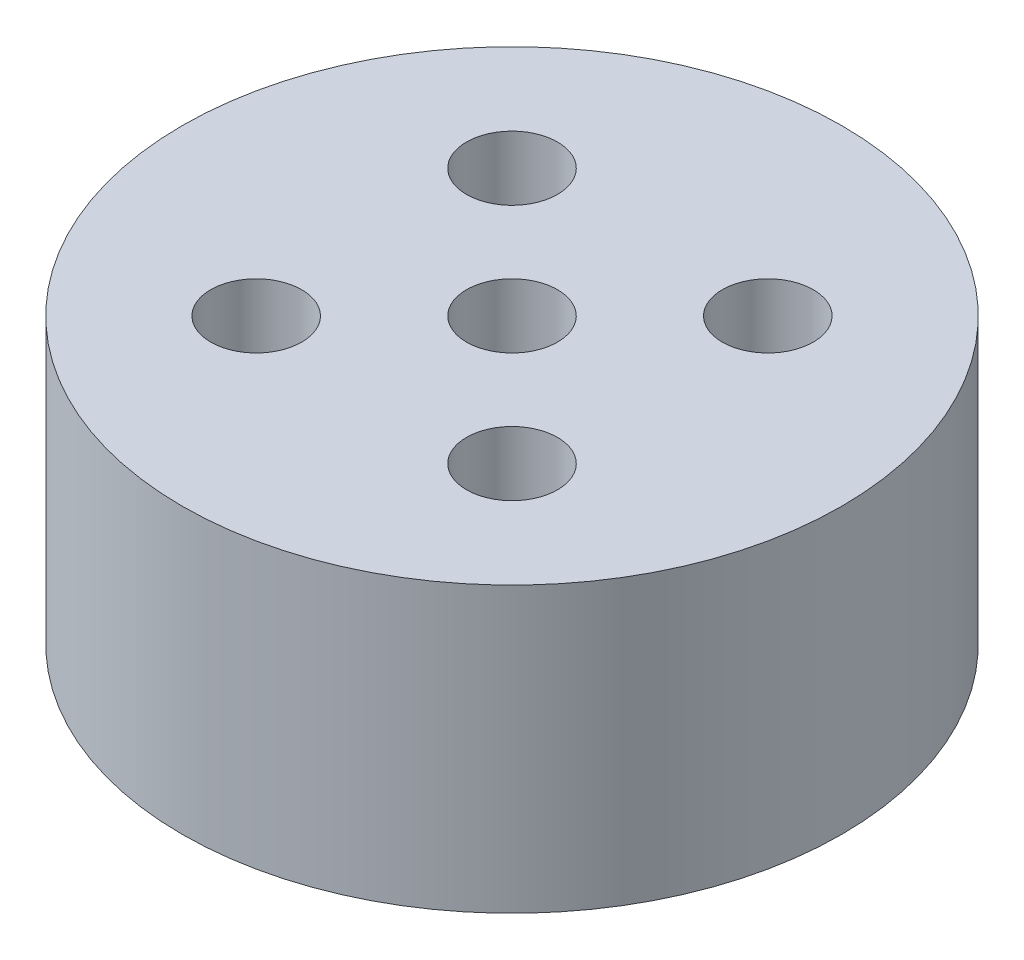
ISO-10303-21;
HEADER;
FILE_DESCRIPTION(('STEP AP214'),'2;1');
FILE_NAME('part.step','',(''),(''),'','','');
FILE_SCHEMA(('AUTOMOTIVE_DESIGN { 1 0 10303 214 1 1 1 1 }'));
ENDSEC;
DATA;
#1=APPLICATION_CONTEXT('core data for automotive mechanical design processes');
#2=APPLICATION_PROTOCOL_DEFINITION('international standard','automotive_design',2000,#1);
#3=PRODUCT_CONTEXT('',#1,'mechanical');
#4=PRODUCT('Part','Part','',(#3));
#5=PRODUCT_RELATED_PRODUCT_CATEGORY('part','',(#4));
#6=PRODUCT_DEFINITION_FORMATION('','',#4);
#7=PRODUCT_DEFINITION_CONTEXT('part definition',#1,'design');
#8=PRODUCT_DEFINITION('design','',#6,#7);
#9=PRODUCT_DEFINITION_SHAPE('','',#8);
#10=(LENGTH_UNIT() NAMED_UNIT(*) SI_UNIT(.MILLI.,.METRE.));
#11=(NAMED_UNIT(*) PLANE_ANGLE_UNIT() SI_UNIT($,.RADIAN.));
#12=(NAMED_UNIT(*) SI_UNIT($,.STERADIAN.) SOLID_ANGLE_UNIT());
#13=UNCERTAINTY_MEASURE_WITH_UNIT(LENGTH_MEASURE(1.E-05),#10,'distance_accuracy_value','');
#14=(GEOMETRIC_REPRESENTATION_CONTEXT(3) GLOBAL_UNCERTAINTY_ASSIGNED_CONTEXT((#13)) GLOBAL_UNIT_ASSIGNED_CONTEXT((#10,
#11,#12)) REPRESENTATION_CONTEXT('',''));
#15=CARTESIAN_POINT('',(0.,0.,0.));
#16=DIRECTION('',(0.,0.,1.));
#17=DIRECTION('',(1.,0.,0.));
#18=AXIS2_PLACEMENT_3D('',#15,#16,#17);
#19=CARTESIAN_POINT('',(-14.7209328967892,12.7,-5.38710001266121));
#20=DIRECTION('',(0.,-1.,0.));
#21=DIRECTION('',(0.,0.,-1.));
#22=AXIS2_PLACEMENT_3D('',#19,#20,#21);
#23=CYLINDRICAL_SURFACE('',#22,14.732);
#24=CARTESIAN_POINT('',(-14.7209328967892,12.7,-5.38710001266121));
#25=DIRECTION('',(0.,1.,0.));
#26=DIRECTION('',(0.,0.,1.));
#27=AXIS2_PLACEMENT_3D('',#24,#25,#26);
#28=CIRCLE('',#27,14.732);
#29=CARTESIAN_POINT('',(-14.7209328967892,12.7,9.34489998733879));
#30=VERTEX_POINT('',#29);
#31=EDGE_CURVE('E10',#30,#30,#28,.T.);
#32=ORIENTED_EDGE('',*,*,#31,.F.);
#33=EDGE_LOOP('',(#32));
#34=FACE_BOUND('',#33,.T.);
#35=CARTESIAN_POINT('',(-14.7209328967892,0.,-5.38710001266121));
#36=DIRECTION('',(0.,1.,0.));
#37=DIRECTION('',(0.,0.,1.));
#38=AXIS2_PLACEMENT_3D('',#35,#36,#37);
#39=CIRCLE('',#38,14.732);
#40=CARTESIAN_POINT('',(-14.7209328967892,0.,9.34489998733879));
#41=VERTEX_POINT('',#40);
#42=EDGE_CURVE('E36',#41,#41,#39,.T.);
#43=ORIENTED_EDGE('',*,*,#42,.T.);
#44=EDGE_LOOP('',(#43));
#45=FACE_BOUND('',#44,.T.);
#46=ADVANCED_FACE('F33',(#34,#45),#23,.T.);
#47=CARTESIAN_POINT('',(-14.7209328967892,12.7,-5.38710001266121));
#48=DIRECTION('',(0.,1.,0.));
#49=DIRECTION('',(0.,0.,1.));
#50=AXIS2_PLACEMENT_3D('',#47,#48,#49);
#51=PLANE('',#50);
#52=CARTESIAN_POINT('',(-9.00593289678917,12.7,-11.1021000126612));
#53=DIRECTION('',(0.,1.,0.));
#54=DIRECTION('',(0.,0.,1.));
#55=AXIS2_PLACEMENT_3D('',#52,#53,#54);
#56=CIRCLE('',#55,2.032);
#57=CARTESIAN_POINT('',(-9.00593289678917,12.7,-9.07010001266121));
#58=VERTEX_POINT('',#57);
#59=EDGE_CURVE('E69',#58,#58,#56,.T.);
#60=ORIENTED_EDGE('',*,*,#59,.F.);
#61=EDGE_LOOP('',(#60));
#62=FACE_BOUND('',#61,.T.);
#63=CARTESIAN_POINT('',(-20.4359328967892,12.7,-11.1021000126612));
#64=DIRECTION('',(0.,1.,0.));
#65=DIRECTION('',(0.,0.,1.));
#66=AXIS2_PLACEMENT_3D('',#63,#64,#65);
#67=CIRCLE('',#66,2.032);
#68=CARTESIAN_POINT('',(-20.4359328967892,12.7,-9.07010001266121));
#69=VERTEX_POINT('',#68);
#70=EDGE_CURVE('E63',#69,#69,#67,.T.);
#71=ORIENTED_EDGE('',*,*,#70,.F.);
#72=EDGE_LOOP('',(#71));
#73=FACE_BOUND('',#72,.T.);
#74=CARTESIAN_POINT('',(-20.4359328967892,12.7,0.327899987338791));
#75=DIRECTION('',(0.,1.,0.));
#76=DIRECTION('',(0.,0.,1.));
#77=AXIS2_PLACEMENT_3D('',#74,#75,#76);
#78=CIRCLE('',#77,2.032);
#79=CARTESIAN_POINT('',(-20.4359328967892,12.7,2.35989998733879));
#80=VERTEX_POINT('',#79);
#81=EDGE_CURVE('E57',#80,#80,#78,.T.);
#82=ORIENTED_EDGE('',*,*,#81,.F.);
#83=EDGE_LOOP('',(#82));
#84=FACE_BOUND('',#83,.T.);
#85=CARTESIAN_POINT('',(-14.7209328967892,12.7,-5.38710001266121));
#86=DIRECTION('',(0.,1.,0.));
#87=DIRECTION('',(0.,0.,1.));
#88=AXIS2_PLACEMENT_3D('',#85,#86,#87);
#89=CIRCLE('',#88,2.032);
#90=CARTESIAN_POINT('',(-14.7209328967892,12.7,-3.35510001266121));
#91=VERTEX_POINT('',#90);
#92=EDGE_CURVE('E51',#91,#91,#89,.T.);
#93=ORIENTED_EDGE('',*,*,#92,.F.);
#94=EDGE_LOOP('',(#93));
#95=FACE_BOUND('',#94,.T.);
#96=CARTESIAN_POINT('',(-9.00593289678917,12.7,0.327899987338791));
#97=DIRECTION('',(0.,1.,0.));
#98=DIRECTION('',(0.,0.,1.));
#99=AXIS2_PLACEMENT_3D('',#96,#97,#98);
#100=CIRCLE('',#99,2.032);
#101=CARTESIAN_POINT('',(-9.00593289678917,12.7,2.35989998733879));
#102=VERTEX_POINT('',#101);
#103=EDGE_CURVE('E45',#102,#102,#100,.T.);
#104=ORIENTED_EDGE('',*,*,#103,.F.);
#105=EDGE_LOOP('',(#104));
#106=FACE_BOUND('',#105,.T.);
#107=ORIENTED_EDGE('',*,*,#31,.T.);
#108=EDGE_LOOP('',(#107));
#109=FACE_BOUND('',#108,.T.);
#110=ADVANCED_FACE('F85',(#62,#73,#84,#95,#106,#109),#51,.T.);
#111=CARTESIAN_POINT('',(-14.7209328967892,0.,-5.38710001266121));
#112=DIRECTION('',(0.,1.,0.));
#113=DIRECTION('',(0.,0.,1.));
#114=AXIS2_PLACEMENT_3D('',#111,#112,#113);
#115=PLANE('',#114);
#116=CARTESIAN_POINT('',(-9.00593289678917,0.,-11.1021000126612));
#117=DIRECTION('',(0.,1.,0.));
#118=DIRECTION('',(0.,0.,1.));
#119=AXIS2_PLACEMENT_3D('',#116,#117,#118);
#120=CIRCLE('',#119,2.032);
#121=CARTESIAN_POINT('',(-9.00593289678917,0.,-9.07010001266121));
#122=VERTEX_POINT('',#121);
#123=EDGE_CURVE('E48',#122,#122,#120,.T.);
#124=ORIENTED_EDGE('',*,*,#123,.T.);
#125=EDGE_LOOP('',(#124));
#126=FACE_BOUND('',#125,.T.);
#127=CARTESIAN_POINT('',(-20.4359328967892,0.,-11.1021000126612));
#128=DIRECTION('',(0.,1.,0.));
#129=DIRECTION('',(0.,0.,1.));
#130=AXIS2_PLACEMENT_3D('',#127,#128,#129);
#131=CIRCLE('',#130,2.032);
#132=CARTESIAN_POINT('',(-20.4359328967892,0.,-9.07010001266121));
#133=VERTEX_POINT('',#132);
#134=EDGE_CURVE('E66',#133,#133,#131,.T.);
#135=ORIENTED_EDGE('',*,*,#134,.T.);
#136=EDGE_LOOP('',(#135));
#137=FACE_BOUND('',#136,.T.);
#138=CARTESIAN_POINT('',(-20.4359328967892,0.,0.327899987338791));
#139=DIRECTION('',(0.,1.,0.));
#140=DIRECTION('',(0.,0.,1.));
#141=AXIS2_PLACEMENT_3D('',#138,#139,#140);
#142=CIRCLE('',#141,2.032);
#143=CARTESIAN_POINT('',(-20.4359328967892,0.,2.35989998733879));
#144=VERTEX_POINT('',#143);
#145=EDGE_CURVE('E60',#144,#144,#142,.T.);
#146=ORIENTED_EDGE('',*,*,#145,.T.);
#147=EDGE_LOOP('',(#146));
#148=FACE_BOUND('',#147,.T.);
#149=CARTESIAN_POINT('',(-14.7209328967892,0.,-5.38710001266121));
#150=DIRECTION('',(0.,1.,0.));
#151=DIRECTION('',(0.,0.,1.));
#152=AXIS2_PLACEMENT_3D('',#149,#150,#151);
#153=CIRCLE('',#152,2.032);
#154=CARTESIAN_POINT('',(-14.7209328967892,0.,-3.35510001266121));
#155=VERTEX_POINT('',#154);
#156=EDGE_CURVE('E54',#155,#155,#153,.T.);
#157=ORIENTED_EDGE('',*,*,#156,.T.);
#158=EDGE_LOOP('',(#157));
#159=FACE_BOUND('',#158,.T.);
#160=CARTESIAN_POINT('',(-9.00593289678917,0.,0.327899987338791));
#161=DIRECTION('',(0.,1.,0.));
#162=DIRECTION('',(0.,0.,1.));
#163=AXIS2_PLACEMENT_3D('',#160,#161,#162);
#164=CIRCLE('',#163,2.032);
#165=CARTESIAN_POINT('',(-9.00593289678917,0.,2.35989998733879));
#166=VERTEX_POINT('',#165);
#167=EDGE_CURVE('E43',#166,#166,#164,.T.);
#168=ORIENTED_EDGE('',*,*,#167,.T.);
#169=EDGE_LOOP('',(#168));
#170=FACE_BOUND('',#169,.T.);
#171=ORIENTED_EDGE('',*,*,#42,.F.);
#172=EDGE_LOOP('',(#171));
#173=FACE_BOUND('',#172,.T.);
#174=ADVANCED_FACE('F75',(#126,#137,#148,#159,#170,#173),#115,.F.);
#175=CARTESIAN_POINT('',(-9.00593289678917,0.,0.327899987338791));
#176=DIRECTION('',(0.,1.,0.));
#177=DIRECTION('',(0.,0.,1.));
#178=AXIS2_PLACEMENT_3D('',#175,#176,#177);
#179=CYLINDRICAL_SURFACE('',#178,2.032);
#180=ORIENTED_EDGE('',*,*,#167,.F.);
#181=EDGE_LOOP('',(#180));
#182=FACE_BOUND('',#181,.T.);
#183=ORIENTED_EDGE('',*,*,#103,.T.);
#184=EDGE_LOOP('',(#183));
#185=FACE_BOUND('',#184,.T.);
#186=ADVANCED_FACE('F97',(#182,#185),#179,.F.);
#187=CARTESIAN_POINT('',(-14.7209328967892,0.,-5.38710001266121));
#188=DIRECTION('',(0.,1.,0.));
#189=DIRECTION('',(0.,0.,1.));
#190=AXIS2_PLACEMENT_3D('',#187,#188,#189);
#191=CYLINDRICAL_SURFACE('',#190,2.032);
#192=ORIENTED_EDGE('',*,*,#156,.F.);
#193=EDGE_LOOP('',(#192));
#194=FACE_BOUND('',#193,.T.);
#195=ORIENTED_EDGE('',*,*,#92,.T.);
#196=EDGE_LOOP('',(#195));
#197=FACE_BOUND('',#196,.T.);
#198=ADVANCED_FACE('F99',(#194,#197),#191,.F.);
#199=CARTESIAN_POINT('',(-20.4359328967892,0.,0.327899987338791));
#200=DIRECTION('',(0.,1.,0.));
#201=DIRECTION('',(0.,0.,1.));
#202=AXIS2_PLACEMENT_3D('',#199,#200,#201);
#203=CYLINDRICAL_SURFACE('',#202,2.032);
#204=ORIENTED_EDGE('',*,*,#145,.F.);
#205=EDGE_LOOP('',(#204));
#206=FACE_BOUND('',#205,.T.);
#207=ORIENTED_EDGE('',*,*,#81,.T.);
#208=EDGE_LOOP('',(#207));
#209=FACE_BOUND('',#208,.T.);
#210=ADVANCED_FACE('F106',(#206,#209),#203,.F.);
#211=CARTESIAN_POINT('',(-20.4359328967892,0.,-11.1021000126612));
#212=DIRECTION('',(0.,1.,0.));
#213=DIRECTION('',(0.,0.,1.));
#214=AXIS2_PLACEMENT_3D('',#211,#212,#213);
#215=CYLINDRICAL_SURFACE('',#214,2.032);
#216=ORIENTED_EDGE('',*,*,#134,.F.);
#217=EDGE_LOOP('',(#216));
#218=FACE_BOUND('',#217,.T.);
#219=ORIENTED_EDGE('',*,*,#70,.T.);
#220=EDGE_LOOP('',(#219));
#221=FACE_BOUND('',#220,.T.);
#222=ADVANCED_FACE('F81',(#218,#221),#215,.F.);
#223=CARTESIAN_POINT('',(-9.00593289678917,0.,-11.1021000126612));
#224=DIRECTION('',(0.,1.,0.));
#225=DIRECTION('',(0.,0.,1.));
#226=AXIS2_PLACEMENT_3D('',#223,#224,#225);
#227=CYLINDRICAL_SURFACE('',#226,2.032);
#228=ORIENTED_EDGE('',*,*,#123,.F.);
#229=EDGE_LOOP('',(#228));
#230=FACE_BOUND('',#229,.T.);
#231=ORIENTED_EDGE('',*,*,#59,.T.);
#232=EDGE_LOOP('',(#231));
#233=FACE_BOUND('',#232,.T.);
#234=ADVANCED_FACE('F78',(#230,#233),#227,.F.);
#235=CLOSED_SHELL('',(#46,#110,#174,#186,#198,#210,#222,#234));
#236=MANIFOLD_SOLID_BREP('B2',#235);
#237=ADVANCED_BREP_SHAPE_REPRESENTATION('',(#18,#236),#14);
#238=SHAPE_DEFINITION_REPRESENTATION(#9,#237);
ENDSEC;
END-ISO-10303-21;
